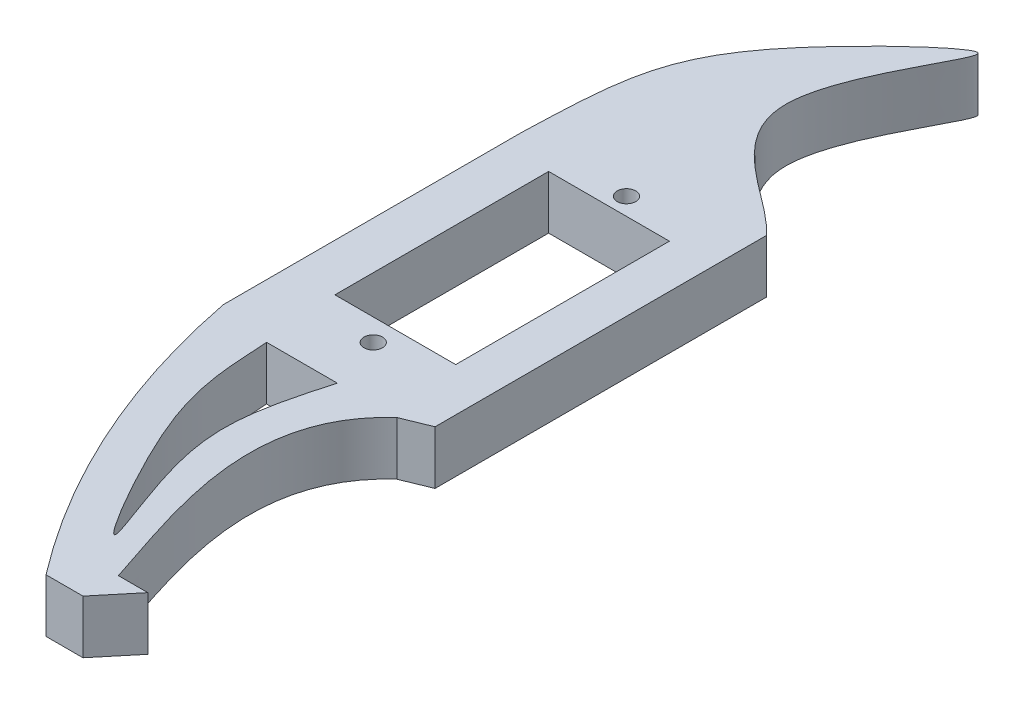
ISO-10303-21;
HEADER;
FILE_DESCRIPTION(('STEP AP214'),'2;1');
FILE_NAME('part.step','',(''),(''),'','','');
FILE_SCHEMA(('AUTOMOTIVE_DESIGN { 1 0 10303 214 1 1 1 1 }'));
ENDSEC;
DATA;
#1=APPLICATION_CONTEXT('core data for automotive mechanical design processes');
#2=APPLICATION_PROTOCOL_DEFINITION('international standard','automotive_design',2000,#1);
#3=PRODUCT_CONTEXT('',#1,'mechanical');
#4=PRODUCT('Part','Part','',(#3));
#5=PRODUCT_RELATED_PRODUCT_CATEGORY('part','',(#4));
#6=PRODUCT_DEFINITION_FORMATION('','',#4);
#7=PRODUCT_DEFINITION_CONTEXT('part definition',#1,'design');
#8=PRODUCT_DEFINITION('design','',#6,#7);
#9=PRODUCT_DEFINITION_SHAPE('','',#8);
#10=(LENGTH_UNIT() NAMED_UNIT(*) SI_UNIT(.MILLI.,.METRE.));
#11=(NAMED_UNIT(*) PLANE_ANGLE_UNIT() SI_UNIT($,.RADIAN.));
#12=(NAMED_UNIT(*) SI_UNIT($,.STERADIAN.) SOLID_ANGLE_UNIT());
#13=UNCERTAINTY_MEASURE_WITH_UNIT(LENGTH_MEASURE(1.E-05),#10,'distance_accuracy_value','');
#14=(GEOMETRIC_REPRESENTATION_CONTEXT(3) GLOBAL_UNCERTAINTY_ASSIGNED_CONTEXT((#13)) GLOBAL_UNIT_ASSIGNED_CONTEXT((#10,
#11,#12)) REPRESENTATION_CONTEXT('',''));
#15=CARTESIAN_POINT('',(0.,0.,0.));
#16=DIRECTION('',(0.,0.,1.));
#17=DIRECTION('',(1.,0.,0.));
#18=AXIS2_PLACEMENT_3D('',#15,#16,#17);
#19=CARTESIAN_POINT('',(19.0483910188657,5.75,-30.8771689485688));
#20=DIRECTION('',(0.,-1.,0.));
#21=DIRECTION('',(0.,0.,-1.));
#22=AXIS2_PLACEMENT_3D('',#19,#20,#21);
#23=PLANE('',#22);
#24=CARTESIAN_POINT('',(15.1920200688134,5.75,-78.3835662755962));
#25=DIRECTION('',(0.,1.,0.));
#26=DIRECTION('',(0.,0.,1.));
#27=AXIS2_PLACEMENT_3D('',#24,#25,#26);
#28=CIRCLE('',#27,1.00000000000001);
#29=CARTESIAN_POINT('',(15.1920200688134,5.75,-77.3835662755962));
#30=VERTEX_POINT('',#29);
#31=EDGE_CURVE('E533',#30,#30,#28,.T.);
#32=ORIENTED_EDGE('',*,*,#31,.F.);
#33=EDGE_LOOP('',(#32));
#34=FACE_BOUND('',#33,.T.);
#35=CARTESIAN_POINT('',(15.1920200688134,5.75,-51.1335662755962));
#36=DIRECTION('',(0.,1.,0.));
#37=DIRECTION('',(0.,0.,1.));
#38=AXIS2_PLACEMENT_3D('',#35,#36,#37);
#39=CIRCLE('',#38,0.999999999999998);
#40=CARTESIAN_POINT('',(15.1920200688134,5.75,-50.1335662755962));
#41=VERTEX_POINT('',#40);
#42=EDGE_CURVE('E168',#41,#41,#39,.T.);
#43=ORIENTED_EDGE('',*,*,#42,.F.);
#44=EDGE_LOOP('',(#43));
#45=FACE_BOUND('',#44,.T.);
#46=DIRECTION('',(0.,0.,1.));
#47=VECTOR('',#46,1.);
#48=CARTESIAN_POINT('',(21.6920200688134,5.75,-76.5085662755962));
#49=LINE('',#48,#47);
#50=CARTESIAN_POINT('',(21.6920200688134,5.75,-76.5085662755962));
#51=VERTEX_POINT('',#50);
#52=CARTESIAN_POINT('',(21.6920200688134,5.75,-53.5085662755962));
#53=VERTEX_POINT('',#52);
#54=EDGE_CURVE('E162',#51,#53,#49,.T.);
#55=ORIENTED_EDGE('',*,*,#54,.T.);
#56=DIRECTION('',(1.,0.,0.));
#57=VECTOR('',#56,1.);
#58=CARTESIAN_POINT('',(20.9420200688134,5.75,-53.5085662755962));
#59=LINE('',#58,#57);
#60=CARTESIAN_POINT('',(8.69202006881276,5.75,-53.5085662755962));
#61=VERTEX_POINT('',#60);
#62=EDGE_CURVE('E153',#61,#53,#59,.T.);
#63=ORIENTED_EDGE('',*,*,#62,.F.);
#64=DIRECTION('',(0.,0.,1.));
#65=VECTOR('',#64,1.);
#66=CARTESIAN_POINT('',(8.69202006881277,5.75,0.));
#67=LINE('',#66,#65);
#68=CARTESIAN_POINT('',(8.69202006881276,5.75,-76.5085662755962));
#69=VERTEX_POINT('',#68);
#70=EDGE_CURVE('E179',#69,#61,#67,.T.);
#71=ORIENTED_EDGE('',*,*,#70,.F.);
#72=DIRECTION('',(-1.,0.,0.));
#73=VECTOR('',#72,1.);
#74=CARTESIAN_POINT('',(9.44202006881276,5.75,-76.5085662755962));
#75=LINE('',#74,#73);
#76=EDGE_CURVE('E187',#51,#69,#75,.T.);
#77=ORIENTED_EDGE('',*,*,#76,.F.);
#78=EDGE_LOOP('',(#55,#63,#71,#77));
#79=FACE_BOUND('',#78,.T.);
#80=CARTESIAN_POINT('',(9.44202006881276,5.75,-45.4087946799536));
#81=CARTESIAN_POINT('',(9.71575170506763,5.75,-40.314684168692));
#82=CARTESIAN_POINT('',(10.0358284543985,5.75,-33.9357504489265));
#83=CARTESIAN_POINT('',(22.1999054978024,5.75,-13.1971961110742));
#84=CARTESIAN_POINT('',(13.7224764971342,5.75,-33.0489839654528));
#85=CARTESIAN_POINT('',(15.2104885690327,5.75,-38.7144059814646));
#86=CARTESIAN_POINT('',(17.0454464333202,5.75,-45.4087946799536));
#87=B_SPLINE_CURVE_WITH_KNOTS('',3,(#80,#81,#82,#83,#84,#85,#86),.UNSPECIFIED.,.F.,.F.,(4,1,1,1,
4),(0.,0.25608681286267,0.513050751056159,0.682655753500473,1.),.UNSPECIFIED.);
#88=CARTESIAN_POINT('',(9.44202006881276,5.75,-45.4087946799536));
#89=VERTEX_POINT('',#88);
#90=CARTESIAN_POINT('',(17.0454464333202,5.75,-45.4087946799536));
#91=VERTEX_POINT('',#90);
#92=EDGE_CURVE('E190',#89,#91,#87,.T.);
#93=ORIENTED_EDGE('',*,*,#92,.F.);
#94=DIRECTION('',(-1.,0.,0.));
#95=VECTOR('',#94,1.);
#96=CARTESIAN_POINT('',(9.44202006881276,5.75,-45.4087946799536));
#97=LINE('',#96,#95);
#98=EDGE_CURVE('E195',#91,#89,#97,.T.);
#99=ORIENTED_EDGE('',*,*,#98,.F.);
#100=EDGE_LOOP('',(#93,#99));
#101=FACE_BOUND('',#100,.T.);
#102=DIRECTION('',(0.92554695620565,0.,-0.378632845720571));
#103=VECTOR('',#102,1.);
#104=CARTESIAN_POINT('',(26.3775586100434,5.75,-46.6019616768082));
#105=LINE('',#104,#103);
#106=CARTESIAN_POINT('',(23.4609281732883,5.75,-45.4087946799536));
#107=VERTEX_POINT('',#106);
#108=CARTESIAN_POINT('',(26.3775586100434,5.75,-46.6019616768082));
#109=VERTEX_POINT('',#108);
#110=EDGE_CURVE('E269',#107,#109,#105,.T.);
#111=ORIENTED_EDGE('',*,*,#110,.T.);
#112=DIRECTION('',(0.,0.,-1.));
#113=VECTOR('',#112,1.);
#114=CARTESIAN_POINT('',(26.3775586100438,5.75,-82.2553721519295));
#115=LINE('',#114,#113);
#116=CARTESIAN_POINT('',(26.3775586100438,5.75,-82.2553721519295));
#117=VERTEX_POINT('',#116);
#118=EDGE_CURVE('E343',#109,#117,#115,.T.);
#119=ORIENTED_EDGE('',*,*,#118,.T.);
#120=CARTESIAN_POINT('',(26.3775586100438,5.75,-82.2553721519295));
#121=CARTESIAN_POINT('',(22.9776874536798,5.75,-86.0646221406842));
#122=CARTESIAN_POINT('',(8.12466218362721,5.75,-91.8440715750146));
#123=CARTESIAN_POINT('',(26.8115043493803,5.75,-117.233625635506));
#124=CARTESIAN_POINT('',(4.16528130687103,5.75,-96.5231996067464));
#125=CARTESIAN_POINT('',(3.97754845297697,5.75,-89.5158525944054));
#126=CARTESIAN_POINT('',(3.60112657571092,5.75,-78.686133294353));
#127=B_SPLINE_CURVE_WITH_KNOTS('',3,(#120,#121,#122,#123,#124,#125,#126),.UNSPECIFIED.,.F.,.F.,
(4,1,1,1,4),(0.,0.243535756029824,0.469285780942286,0.650563803677233,1.),.UNSPECIFIED.);
#128=CARTESIAN_POINT('',(3.60112657571092,5.75,-78.686133294353));
#129=VERTEX_POINT('',#128);
#130=EDGE_CURVE('E299',#117,#129,#127,.T.);
#131=ORIENTED_EDGE('',*,*,#130,.T.);
#132=DIRECTION('',(0.,0.,1.));
#133=VECTOR('',#132,1.);
#134=CARTESIAN_POINT('',(3.60112657571092,5.75,-78.686133294353));
#135=LINE('',#134,#133);
#136=CARTESIAN_POINT('',(3.60112657571092,5.75,-46.6019616768082));
#137=VERTEX_POINT('',#136);
#138=EDGE_CURVE('E318',#129,#137,#135,.T.);
#139=ORIENTED_EDGE('',*,*,#138,.T.);
#140=CARTESIAN_POINT('',(3.60112657571093,5.75,-46.6019616768082));
#141=CARTESIAN_POINT('',(7.36774822974956,5.75,-27.41314657739));
#142=CARTESIAN_POINT('',(19.2342963689623,5.75,-11.8782004684211));
#143=B_SPLINE_CURVE_WITH_KNOTS('',2,(#140,#141,#142),.UNSPECIFIED.,.F.,.F.,(3,3),(0.,1.),.UNSPECIFIED.);
#144=CARTESIAN_POINT('',(19.2342963689623,5.75,-11.8782004684211));
#145=VERTEX_POINT('',#144);
#146=EDGE_CURVE('E314',#137,#145,#143,.T.);
#147=ORIENTED_EDGE('',*,*,#146,.T.);
#148=DIRECTION('',(1.,0.,0.));
#149=VECTOR('',#148,1.);
#150=CARTESIAN_POINT('',(19.2342963689623,5.75,-11.8782004684211));
#151=LINE('',#150,#149);
#152=CARTESIAN_POINT('',(23.2120175490561,5.75,-11.8782004684211));
#153=VERTEX_POINT('',#152);
#154=EDGE_CURVE('E317',#145,#153,#151,.T.);
#155=ORIENTED_EDGE('',*,*,#154,.T.);
#156=CARTESIAN_POINT('',(23.2120175490561,5.75,-11.8782004684211));
#157=CARTESIAN_POINT('',(26.3775586100434,5.75,-15.6885340158092));
#158=B_SPLINE_CURVE_WITH_KNOTS('',1,(#156,#157),.UNSPECIFIED.,.F.,.F.,(2,2),(0.,1.),.UNSPECIFIED.);
#159=CARTESIAN_POINT('',(26.3775586100434,5.75,-15.6885340158092));
#160=VERTEX_POINT('',#159);
#161=EDGE_CURVE('E320',#153,#160,#158,.T.);
#162=ORIENTED_EDGE('',*,*,#161,.T.);
#163=DIRECTION('',(-1.,0.,0.));
#164=VECTOR('',#163,1.);
#165=CARTESIAN_POINT('',(23.2120175490561,5.75,-15.6885340158092));
#166=LINE('',#165,#164);
#167=CARTESIAN_POINT('',(23.2120175490561,5.75,-15.6885340158092));
#168=VERTEX_POINT('',#167);
#169=EDGE_CURVE('E228',#160,#168,#166,.T.);
#170=ORIENTED_EDGE('',*,*,#169,.T.);
#171=CARTESIAN_POINT('',(23.2120175490561,5.75,-15.6885340158092));
#172=CARTESIAN_POINT('',(20.4347451452465,5.75,-24.3444521861075));
#173=CARTESIAN_POINT('',(14.8033156642805,5.75,-37.628888778155));
#174=CARTESIAN_POINT('',(23.4609281732883,5.75,-45.4087946799536));
#175=B_SPLINE_CURVE_WITH_KNOTS('',3,(#171,#172,#173,#174),.UNSPECIFIED.,.F.,.F.,(4,4),(0.,1.),.UNSPECIFIED.);
#176=EDGE_CURVE('E221',#168,#107,#175,.T.);
#177=ORIENTED_EDGE('',*,*,#176,.T.);
#178=EDGE_LOOP('',(#111,#119,#131,#139,#147,#155,#162,#170,#177));
#179=FACE_BOUND('',#178,.T.);
#180=ADVANCED_FACE('F34',(#34,#45,#79,#101,#179),#23,.F.);
#181=CARTESIAN_POINT('',(19.0483910188657,0.,-30.8771689485688));
#182=DIRECTION('',(0.,-1.,0.));
#183=DIRECTION('',(0.,0.,-1.));
#184=AXIS2_PLACEMENT_3D('',#181,#182,#183);
#185=PLANE('',#184);
#186=CARTESIAN_POINT('',(15.1920200688134,0.,-78.3835662755962));
#187=DIRECTION('',(0.,-1.,0.));
#188=DIRECTION('',(0.,0.,-1.));
#189=AXIS2_PLACEMENT_3D('',#186,#187,#188);
#190=CIRCLE('',#189,1.00000000000001);
#191=CARTESIAN_POINT('',(15.1920200688134,0.,-77.3835662755962));
#192=VERTEX_POINT('',#191);
#193=EDGE_CURVE('E530',#192,#192,#190,.F.);
#194=ORIENTED_EDGE('',*,*,#193,.T.);
#195=EDGE_LOOP('',(#194));
#196=FACE_BOUND('',#195,.T.);
#197=CARTESIAN_POINT('',(15.1920200688134,0.,-51.1335662755962));
#198=DIRECTION('',(0.,-1.,0.));
#199=DIRECTION('',(0.,0.,-1.));
#200=AXIS2_PLACEMENT_3D('',#197,#198,#199);
#201=CIRCLE('',#200,0.999999999999998);
#202=CARTESIAN_POINT('',(15.1920200688134,0.,-50.1335662755962));
#203=VERTEX_POINT('',#202);
#204=EDGE_CURVE('E171',#203,#203,#201,.F.);
#205=ORIENTED_EDGE('',*,*,#204,.T.);
#206=EDGE_LOOP('',(#205));
#207=FACE_BOUND('',#206,.T.);
#208=DIRECTION('',(1.,0.,0.));
#209=VECTOR('',#208,1.);
#210=CARTESIAN_POINT('',(20.9420200688134,0.,-53.5085662755962));
#211=LINE('',#210,#209);
#212=CARTESIAN_POINT('',(8.69202006881276,0.,-53.5085662755962));
#213=VERTEX_POINT('',#212);
#214=CARTESIAN_POINT('',(21.6920200688134,0.,-53.5085662755962));
#215=VERTEX_POINT('',#214);
#216=EDGE_CURVE('E154',#213,#215,#211,.T.);
#217=ORIENTED_EDGE('',*,*,#216,.T.);
#218=DIRECTION('',(0.,0.,1.));
#219=VECTOR('',#218,1.);
#220=CARTESIAN_POINT('',(21.6920200688134,0.,-76.5085662755962));
#221=LINE('',#220,#219);
#222=CARTESIAN_POINT('',(21.6920200688134,0.,-76.5085662755962));
#223=VERTEX_POINT('',#222);
#224=EDGE_CURVE('E160',#223,#215,#221,.T.);
#225=ORIENTED_EDGE('',*,*,#224,.F.);
#226=DIRECTION('',(-1.,0.,0.));
#227=VECTOR('',#226,1.);
#228=CARTESIAN_POINT('',(9.44202006881276,0.,-76.5085662755962));
#229=LINE('',#228,#227);
#230=CARTESIAN_POINT('',(8.69202006881276,0.,-76.5085662755962));
#231=VERTEX_POINT('',#230);
#232=EDGE_CURVE('E142',#223,#231,#229,.T.);
#233=ORIENTED_EDGE('',*,*,#232,.T.);
#234=DIRECTION('',(0.,0.,1.));
#235=VECTOR('',#234,1.);
#236=CARTESIAN_POINT('',(8.69202006881277,0.,0.));
#237=LINE('',#236,#235);
#238=EDGE_CURVE('E177',#231,#213,#237,.T.);
#239=ORIENTED_EDGE('',*,*,#238,.T.);
#240=EDGE_LOOP('',(#217,#225,#233,#239));
#241=FACE_BOUND('',#240,.T.);
#242=DIRECTION('',(-1.,0.,0.));
#243=VECTOR('',#242,1.);
#244=CARTESIAN_POINT('',(9.44202006881276,0.,-45.4087946799536));
#245=LINE('',#244,#243);
#246=CARTESIAN_POINT('',(17.0454464333202,0.,-45.4087946799536));
#247=VERTEX_POINT('',#246);
#248=CARTESIAN_POINT('',(9.44202006881276,0.,-45.4087946799536));
#249=VERTEX_POINT('',#248);
#250=EDGE_CURVE('E196',#247,#249,#245,.T.);
#251=ORIENTED_EDGE('',*,*,#250,.T.);
#252=CARTESIAN_POINT('',(9.44202006881276,0.,-45.4087946799536));
#253=CARTESIAN_POINT('',(9.71575170506763,0.,-40.314684168692));
#254=CARTESIAN_POINT('',(10.0358284543985,0.,-33.9357504489265));
#255=CARTESIAN_POINT('',(22.1999054978024,0.,-13.1971961110742));
#256=CARTESIAN_POINT('',(13.7224764971342,0.,-33.0489839654528));
#257=CARTESIAN_POINT('',(15.2104885690327,0.,-38.7144059814646));
#258=CARTESIAN_POINT('',(17.0454464333202,0.,-45.4087946799536));
#259=B_SPLINE_CURVE_WITH_KNOTS('',3,(#252,#253,#254,#255,#256,#257,#258),.UNSPECIFIED.,.F.,.F.,
(4,1,1,1,4),(0.,0.25608681286267,0.513050751056159,0.682655753500473,1.),.UNSPECIFIED.);
#260=EDGE_CURVE('E56',#249,#247,#259,.T.);
#261=ORIENTED_EDGE('',*,*,#260,.T.);
#262=EDGE_LOOP('',(#251,#261));
#263=FACE_BOUND('',#262,.T.);
#264=DIRECTION('',(0.92554695620565,0.,-0.378632845720571));
#265=VECTOR('',#264,1.);
#266=CARTESIAN_POINT('',(26.3775586100434,0.,-46.6019616768082));
#267=LINE('',#266,#265);
#268=CARTESIAN_POINT('',(23.4609281732883,0.,-45.4087946799536));
#269=VERTEX_POINT('',#268);
#270=CARTESIAN_POINT('',(26.3775586100434,0.,-46.6019616768082));
#271=VERTEX_POINT('',#270);
#272=EDGE_CURVE('E230',#269,#271,#267,.T.);
#273=ORIENTED_EDGE('',*,*,#272,.F.);
#274=CARTESIAN_POINT('',(23.2120175490561,0.,-15.6885340158092));
#275=CARTESIAN_POINT('',(20.4347451452465,0.,-24.3444521861075));
#276=CARTESIAN_POINT('',(14.8033156642805,0.,-37.628888778155));
#277=CARTESIAN_POINT('',(23.4609281732883,0.,-45.4087946799536));
#278=B_SPLINE_CURVE_WITH_KNOTS('',3,(#274,#275,#276,#277),.UNSPECIFIED.,.F.,.F.,(4,4),(0.,1.),.UNSPECIFIED.);
#279=CARTESIAN_POINT('',(23.2120175490561,0.,-15.6885340158092));
#280=VERTEX_POINT('',#279);
#281=EDGE_CURVE('E265',#280,#269,#278,.T.);
#282=ORIENTED_EDGE('',*,*,#281,.F.);
#283=DIRECTION('',(-1.,0.,0.));
#284=VECTOR('',#283,1.);
#285=CARTESIAN_POINT('',(23.2120175490561,0.,-15.6885340158092));
#286=LINE('',#285,#284);
#287=CARTESIAN_POINT('',(26.3775586100434,0.,-15.6885340158092));
#288=VERTEX_POINT('',#287);
#289=EDGE_CURVE('E260',#288,#280,#286,.T.);
#290=ORIENTED_EDGE('',*,*,#289,.F.);
#291=CARTESIAN_POINT('',(23.2120175490561,0.,-11.8782004684211));
#292=CARTESIAN_POINT('',(26.3775586100434,0.,-15.6885340158092));
#293=B_SPLINE_CURVE_WITH_KNOTS('',1,(#291,#292),.UNSPECIFIED.,.F.,.F.,(2,2),(0.,1.),.UNSPECIFIED.);
#294=CARTESIAN_POINT('',(23.2120175490561,0.,-11.8782004684211));
#295=VERTEX_POINT('',#294);
#296=EDGE_CURVE('E256',#295,#288,#293,.T.);
#297=ORIENTED_EDGE('',*,*,#296,.F.);
#298=DIRECTION('',(1.,0.,0.));
#299=VECTOR('',#298,1.);
#300=CARTESIAN_POINT('',(19.2342963689623,0.,-11.8782004684211));
#301=LINE('',#300,#299);
#302=CARTESIAN_POINT('',(19.2342963689623,0.,-11.8782004684211));
#303=VERTEX_POINT('',#302);
#304=EDGE_CURVE('E251',#303,#295,#301,.T.);
#305=ORIENTED_EDGE('',*,*,#304,.F.);
#306=CARTESIAN_POINT('',(3.60112657571093,0.,-46.6019616768082));
#307=CARTESIAN_POINT('',(7.36774822974956,0.,-27.41314657739));
#308=CARTESIAN_POINT('',(19.2342963689623,0.,-11.8782004684211));
#309=B_SPLINE_CURVE_WITH_KNOTS('',2,(#306,#307,#308),.UNSPECIFIED.,.F.,.F.,(3,3),(0.,1.),.UNSPECIFIED.);
#310=CARTESIAN_POINT('',(3.60112657571092,0.,-46.6019616768082));
#311=VERTEX_POINT('',#310);
#312=EDGE_CURVE('E247',#311,#303,#309,.T.);
#313=ORIENTED_EDGE('',*,*,#312,.F.);
#314=DIRECTION('',(0.,0.,1.));
#315=VECTOR('',#314,1.);
#316=CARTESIAN_POINT('',(3.60112657571092,0.,-78.686133294353));
#317=LINE('',#316,#315);
#318=CARTESIAN_POINT('',(3.60112657571092,0.,-78.686133294353));
#319=VERTEX_POINT('',#318);
#320=EDGE_CURVE('E242',#319,#311,#317,.T.);
#321=ORIENTED_EDGE('',*,*,#320,.F.);
#322=CARTESIAN_POINT('',(26.3775586100438,0.,-82.2553721519295));
#323=CARTESIAN_POINT('',(22.9776874536798,0.,-86.0646221406842));
#324=CARTESIAN_POINT('',(8.12466218362721,0.,-91.8440715750146));
#325=CARTESIAN_POINT('',(26.8115043493803,0.,-117.233625635506));
#326=CARTESIAN_POINT('',(4.16528130687103,0.,-96.5231996067464));
#327=CARTESIAN_POINT('',(3.97754845297697,0.,-89.5158525944054));
#328=CARTESIAN_POINT('',(3.60112657571092,0.,-78.686133294353));
#329=B_SPLINE_CURVE_WITH_KNOTS('',3,(#322,#323,#324,#325,#326,#327,#328),.UNSPECIFIED.,.F.,.F.,
(4,1,1,1,4),(0.,0.243535756029824,0.469285780942286,0.650563803677233,1.),.UNSPECIFIED.);
#330=CARTESIAN_POINT('',(26.3775586100438,0.,-82.2553721519295));
#331=VERTEX_POINT('',#330);
#332=EDGE_CURVE('E238',#331,#319,#329,.T.);
#333=ORIENTED_EDGE('',*,*,#332,.F.);
#334=DIRECTION('',(0.,0.,-1.));
#335=VECTOR('',#334,1.);
#336=CARTESIAN_POINT('',(26.3775586100438,0.,-82.2553721519295));
#337=LINE('',#336,#335);
#338=EDGE_CURVE('E236',#271,#331,#337,.T.);
#339=ORIENTED_EDGE('',*,*,#338,.F.);
#340=EDGE_LOOP('',(#273,#282,#290,#297,#305,#313,#321,#333,#339));
#341=FACE_BOUND('',#340,.T.);
#342=ADVANCED_FACE('F165',(#196,#207,#241,#263,#341),#185,.T.);
#343=CARTESIAN_POINT('',(26.3775586100434,5.75,-46.6019616768082));
#344=DIRECTION('',(-0.378632845720571,0.,-0.92554695620565));
#345=DIRECTION('',(-0.92554695620565,0.,0.378632845720571));
#346=AXIS2_PLACEMENT_3D('',#343,#344,#345);
#347=PLANE('',#346);
#348=ORIENTED_EDGE('',*,*,#272,.T.);
#349=DIRECTION('',(0.,-1.,0.));
#350=VECTOR('',#349,1.);
#351=CARTESIAN_POINT('',(26.3775586100434,5.75,-46.6019616768082));
#352=LINE('',#351,#350);
#353=EDGE_CURVE('E11',#109,#271,#352,.T.);
#354=ORIENTED_EDGE('',*,*,#353,.F.);
#355=ORIENTED_EDGE('',*,*,#110,.F.);
#356=DIRECTION('',(0.,-1.,0.));
#357=VECTOR('',#356,1.);
#358=CARTESIAN_POINT('',(23.4609281732883,5.75,-45.4087946799536));
#359=LINE('',#358,#357);
#360=EDGE_CURVE('E227',#107,#269,#359,.T.);
#361=ORIENTED_EDGE('',*,*,#360,.T.);
#362=EDGE_LOOP('',(#348,#354,#355,#361));
#363=FACE_BOUND('',#362,.T.);
#364=ADVANCED_FACE('F36',(#363),#347,.F.);
#365=CARTESIAN_POINT('',(26.3775586100438,5.75,-82.2553721519295));
#366=DIRECTION('',(-1.,0.,0.));
#367=DIRECTION('',(0.,0.,1.));
#368=AXIS2_PLACEMENT_3D('',#365,#366,#367);
#369=PLANE('',#368);
#370=ORIENTED_EDGE('',*,*,#338,.T.);
#371=DIRECTION('',(0.,-1.,0.));
#372=VECTOR('',#371,1.);
#373=CARTESIAN_POINT('',(26.3775586100438,5.75,-82.2553721519295));
#374=LINE('',#373,#372);
#375=EDGE_CURVE('E42',#117,#331,#374,.T.);
#376=ORIENTED_EDGE('',*,*,#375,.F.);
#377=ORIENTED_EDGE('',*,*,#118,.F.);
#378=ORIENTED_EDGE('',*,*,#353,.T.);
#379=EDGE_LOOP('',(#370,#376,#377,#378));
#380=FACE_BOUND('',#379,.T.);
#381=ADVANCED_FACE('F338',(#380),#369,.F.);
#382=DIRECTION('',(0.,-1.,0.));
#383=VECTOR('',#382,1.);
#384=SURFACE_OF_LINEAR_EXTRUSION('',#127,#383);
#385=ORIENTED_EDGE('',*,*,#332,.T.);
#386=DIRECTION('',(0.,-1.,0.));
#387=VECTOR('',#386,1.);
#388=CARTESIAN_POINT('',(3.60112657571092,5.75,-78.686133294353));
#389=LINE('',#388,#387);
#390=EDGE_CURVE('E290',#129,#319,#389,.T.);
#391=ORIENTED_EDGE('',*,*,#390,.F.);
#392=ORIENTED_EDGE('',*,*,#130,.F.);
#393=ORIENTED_EDGE('',*,*,#375,.T.);
#394=EDGE_LOOP('',(#385,#391,#392,#393));
#395=FACE_BOUND('',#394,.T.);
#396=ADVANCED_FACE('F297',(#395),#384,.F.);
#397=CARTESIAN_POINT('',(3.60112657571092,5.75,-78.686133294353));
#398=DIRECTION('',(1.,0.,0.));
#399=DIRECTION('',(0.,0.,-1.));
#400=AXIS2_PLACEMENT_3D('',#397,#398,#399);
#401=PLANE('',#400);
#402=ORIENTED_EDGE('',*,*,#320,.T.);
#403=DIRECTION('',(0.,-1.,0.));
#404=VECTOR('',#403,1.);
#405=CARTESIAN_POINT('',(3.60112657571092,5.75,-46.6019616768082));
#406=LINE('',#405,#404);
#407=EDGE_CURVE('E287',#137,#311,#406,.T.);
#408=ORIENTED_EDGE('',*,*,#407,.F.);
#409=ORIENTED_EDGE('',*,*,#138,.F.);
#410=ORIENTED_EDGE('',*,*,#390,.T.);
#411=EDGE_LOOP('',(#402,#408,#409,#410));
#412=FACE_BOUND('',#411,.T.);
#413=ADVANCED_FACE('F308',(#412),#401,.F.);
#414=DIRECTION('',(0.,-1.,0.));
#415=VECTOR('',#414,1.);
#416=SURFACE_OF_LINEAR_EXTRUSION('',#143,#415);
#417=ORIENTED_EDGE('',*,*,#312,.T.);
#418=DIRECTION('',(0.,-1.,0.));
#419=VECTOR('',#418,1.);
#420=CARTESIAN_POINT('',(19.2342963689623,5.75,-11.8782004684211));
#421=LINE('',#420,#419);
#422=EDGE_CURVE('E284',#145,#303,#421,.T.);
#423=ORIENTED_EDGE('',*,*,#422,.F.);
#424=ORIENTED_EDGE('',*,*,#146,.F.);
#425=ORIENTED_EDGE('',*,*,#407,.T.);
#426=EDGE_LOOP('',(#417,#423,#424,#425));
#427=FACE_BOUND('',#426,.T.);
#428=ADVANCED_FACE('F312',(#427),#416,.F.);
#429=CARTESIAN_POINT('',(19.2342963689623,5.75,-11.8782004684211));
#430=DIRECTION('',(0.,0.,-1.));
#431=DIRECTION('',(-1.,0.,0.));
#432=AXIS2_PLACEMENT_3D('',#429,#430,#431);
#433=PLANE('',#432);
#434=ORIENTED_EDGE('',*,*,#304,.T.);
#435=DIRECTION('',(0.,-1.,0.));
#436=VECTOR('',#435,1.);
#437=CARTESIAN_POINT('',(23.2120175490561,5.75,-11.8782004684211));
#438=LINE('',#437,#436);
#439=EDGE_CURVE('E281',#153,#295,#438,.T.);
#440=ORIENTED_EDGE('',*,*,#439,.F.);
#441=ORIENTED_EDGE('',*,*,#154,.F.);
#442=ORIENTED_EDGE('',*,*,#422,.T.);
#443=EDGE_LOOP('',(#434,#440,#441,#442));
#444=FACE_BOUND('',#443,.T.);
#445=ADVANCED_FACE('F334',(#444),#433,.F.);
#446=CARTESIAN_POINT('',(23.2120175490561,5.75,-11.8782004684211));
#447=DIRECTION('',(-0.769187079710325,0.,-0.639023658722197));
#448=DIRECTION('',(-0.639023658722197,0.,0.769187079710325));
#449=AXIS2_PLACEMENT_3D('',#446,#447,#448);
#450=PLANE('',#449);
#451=ORIENTED_EDGE('',*,*,#296,.T.);
#452=DIRECTION('',(0.,-1.,0.));
#453=VECTOR('',#452,1.);
#454=CARTESIAN_POINT('',(26.3775586100434,5.75,-15.6885340158092));
#455=LINE('',#454,#453);
#456=EDGE_CURVE('E278',#160,#288,#455,.T.);
#457=ORIENTED_EDGE('',*,*,#456,.F.);
#458=ORIENTED_EDGE('',*,*,#161,.F.);
#459=ORIENTED_EDGE('',*,*,#439,.T.);
#460=EDGE_LOOP('',(#451,#457,#458,#459));
#461=FACE_BOUND('',#460,.T.);
#462=ADVANCED_FACE('F452',(#461),#450,.F.);
#463=CARTESIAN_POINT('',(23.2120175490561,5.75,-15.6885340158092));
#464=DIRECTION('',(0.,0.,1.));
#465=DIRECTION('',(1.,0.,0.));
#466=AXIS2_PLACEMENT_3D('',#463,#464,#465);
#467=PLANE('',#466);
#468=ORIENTED_EDGE('',*,*,#289,.T.);
#469=DIRECTION('',(0.,-1.,0.));
#470=VECTOR('',#469,1.);
#471=CARTESIAN_POINT('',(23.2120175490561,5.75,-15.6885340158092));
#472=LINE('',#471,#470);
#473=EDGE_CURVE('E275',#168,#280,#472,.T.);
#474=ORIENTED_EDGE('',*,*,#473,.F.);
#475=ORIENTED_EDGE('',*,*,#169,.F.);
#476=ORIENTED_EDGE('',*,*,#456,.T.);
#477=EDGE_LOOP('',(#468,#474,#475,#476));
#478=FACE_BOUND('',#477,.T.);
#479=ADVANCED_FACE('F218',(#478),#467,.F.);
#480=DIRECTION('',(0.,-1.,0.));
#481=VECTOR('',#480,1.);
#482=SURFACE_OF_LINEAR_EXTRUSION('',#175,#481);
#483=ORIENTED_EDGE('',*,*,#281,.T.);
#484=ORIENTED_EDGE('',*,*,#360,.F.);
#485=ORIENTED_EDGE('',*,*,#176,.F.);
#486=ORIENTED_EDGE('',*,*,#473,.T.);
#487=EDGE_LOOP('',(#483,#484,#485,#486));
#488=FACE_BOUND('',#487,.T.);
#489=ADVANCED_FACE('F207',(#488),#482,.F.);
#490=DIRECTION('',(0.,-1.,0.));
#491=VECTOR('',#490,1.);
#492=SURFACE_OF_LINEAR_EXTRUSION('',#87,#491);
#493=ORIENTED_EDGE('',*,*,#260,.F.);
#494=DIRECTION('',(0.,-1.,0.));
#495=VECTOR('',#494,1.);
#496=CARTESIAN_POINT('',(9.44202006881276,5.75,-45.4087946799536));
#497=LINE('',#496,#495);
#498=EDGE_CURVE('E351',#89,#249,#497,.T.);
#499=ORIENTED_EDGE('',*,*,#498,.F.);
#500=ORIENTED_EDGE('',*,*,#92,.T.);
#501=DIRECTION('',(0.,-1.,0.));
#502=VECTOR('',#501,1.);
#503=CARTESIAN_POINT('',(17.0454464333202,5.75,-45.4087946799536));
#504=LINE('',#503,#502);
#505=EDGE_CURVE('E49',#91,#247,#504,.T.);
#506=ORIENTED_EDGE('',*,*,#505,.T.);
#507=EDGE_LOOP('',(#493,#499,#500,#506));
#508=FACE_BOUND('',#507,.T.);
#509=ADVANCED_FACE('F202',(#508),#492,.T.);
#510=CARTESIAN_POINT('',(9.44202006881276,5.75,-45.4087946799536));
#511=DIRECTION('',(0.,0.,1.));
#512=DIRECTION('',(1.,0.,0.));
#513=AXIS2_PLACEMENT_3D('',#510,#511,#512);
#514=PLANE('',#513);
#515=ORIENTED_EDGE('',*,*,#250,.F.);
#516=ORIENTED_EDGE('',*,*,#505,.F.);
#517=ORIENTED_EDGE('',*,*,#98,.T.);
#518=ORIENTED_EDGE('',*,*,#498,.T.);
#519=EDGE_LOOP('',(#515,#516,#517,#518));
#520=FACE_BOUND('',#519,.T.);
#521=ADVANCED_FACE('F206',(#520),#514,.T.);
#522=CARTESIAN_POINT('',(20.9420200688134,5.75,-53.5085662755962));
#523=DIRECTION('',(0.,0.,-1.));
#524=DIRECTION('',(-1.,0.,0.));
#525=AXIS2_PLACEMENT_3D('',#522,#523,#524);
#526=PLANE('',#525);
#527=ORIENTED_EDGE('',*,*,#216,.F.);
#528=DIRECTION('',(0.,1.,0.));
#529=VECTOR('',#528,1.);
#530=CARTESIAN_POINT('',(8.69202006881276,-0.00100000000000013,-53.5085662755962));
#531=LINE('',#530,#529);
#532=EDGE_CURVE('E182',#213,#61,#531,.T.);
#533=ORIENTED_EDGE('',*,*,#532,.T.);
#534=ORIENTED_EDGE('',*,*,#62,.T.);
#535=DIRECTION('',(0.,1.,0.));
#536=VECTOR('',#535,1.);
#537=CARTESIAN_POINT('',(21.6920200688134,-0.00100000000000013,-53.5085662755962));
#538=LINE('',#537,#536);
#539=EDGE_CURVE('E163',#215,#53,#538,.T.);
#540=ORIENTED_EDGE('',*,*,#539,.F.);
#541=EDGE_LOOP('',(#527,#533,#534,#540));
#542=FACE_BOUND('',#541,.T.);
#543=ADVANCED_FACE('F413',(#542),#526,.T.);
#544=CARTESIAN_POINT('',(9.44202006881276,5.75,-76.5085662755962));
#545=DIRECTION('',(0.,0.,1.));
#546=DIRECTION('',(1.,0.,0.));
#547=AXIS2_PLACEMENT_3D('',#544,#545,#546);
#548=PLANE('',#547);
#549=ORIENTED_EDGE('',*,*,#232,.F.);
#550=DIRECTION('',(0.,1.,0.));
#551=VECTOR('',#550,1.);
#552=CARTESIAN_POINT('',(21.6920200688134,-0.00100000000000013,-76.5085662755962));
#553=LINE('',#552,#551);
#554=EDGE_CURVE('E145',#223,#51,#553,.T.);
#555=ORIENTED_EDGE('',*,*,#554,.T.);
#556=ORIENTED_EDGE('',*,*,#76,.T.);
#557=DIRECTION('',(0.,1.,0.));
#558=VECTOR('',#557,1.);
#559=CARTESIAN_POINT('',(8.69202006881276,-0.00100000000000013,-76.5085662755962));
#560=LINE('',#559,#558);
#561=EDGE_CURVE('E148',#231,#69,#560,.T.);
#562=ORIENTED_EDGE('',*,*,#561,.F.);
#563=EDGE_LOOP('',(#549,#555,#556,#562));
#564=FACE_BOUND('',#563,.T.);
#565=ADVANCED_FACE('F144',(#564),#548,.T.);
#566=CARTESIAN_POINT('',(8.69202006881277,-0.00100000000000013,0.));
#567=DIRECTION('',(-1.,0.,0.));
#568=DIRECTION('',(0.,0.,1.));
#569=AXIS2_PLACEMENT_3D('',#566,#567,#568);
#570=PLANE('',#569);
#571=ORIENTED_EDGE('',*,*,#561,.T.);
#572=ORIENTED_EDGE('',*,*,#70,.T.);
#573=ORIENTED_EDGE('',*,*,#532,.F.);
#574=ORIENTED_EDGE('',*,*,#238,.F.);
#575=EDGE_LOOP('',(#571,#572,#573,#574));
#576=FACE_BOUND('',#575,.T.);
#577=ADVANCED_FACE('F393',(#576),#570,.F.);
#578=CARTESIAN_POINT('',(21.6920200688134,-0.00100000000000013,-76.5085662755962));
#579=DIRECTION('',(-1.,0.,0.));
#580=DIRECTION('',(0.,0.,1.));
#581=AXIS2_PLACEMENT_3D('',#578,#579,#580);
#582=PLANE('',#581);
#583=ORIENTED_EDGE('',*,*,#224,.T.);
#584=ORIENTED_EDGE('',*,*,#539,.T.);
#585=ORIENTED_EDGE('',*,*,#54,.F.);
#586=ORIENTED_EDGE('',*,*,#554,.F.);
#587=EDGE_LOOP('',(#583,#584,#585,#586));
#588=FACE_BOUND('',#587,.T.);
#589=ADVANCED_FACE('F158',(#588),#582,.T.);
#590=CARTESIAN_POINT('',(15.1920200688134,-0.00100000000000013,-51.1335662755962));
#591=DIRECTION('',(0.,1.,0.));
#592=DIRECTION('',(0.,0.,1.));
#593=AXIS2_PLACEMENT_3D('',#590,#591,#592);
#594=CYLINDRICAL_SURFACE('',#593,0.999999999999998);
#595=CARTESIAN_POINT('',(15.1920200688134,0.,-50.1335662755962));
#596=CARTESIAN_POINT('',(15.1920200688134,0.0598958333333332,-50.1335662755962));
#597=CARTESIAN_POINT('',(15.1920200688134,0.119791666666667,-50.1335662755962));
#598=CARTESIAN_POINT('',(15.1920200688134,0.239583333333333,-50.1335662755962));
#599=CARTESIAN_POINT('',(15.1920200688134,0.299479166666667,-50.1335662755962));
#600=CARTESIAN_POINT('',(15.1920200688134,0.419270833333333,-50.1335662755962));
#601=CARTESIAN_POINT('',(15.1920200688134,0.479166666666667,-50.1335662755962));
#602=CARTESIAN_POINT('',(15.1920200688134,0.598958333333333,-50.1335662755962));
#603=CARTESIAN_POINT('',(15.1920200688134,0.658854166666667,-50.1335662755962));
#604=CARTESIAN_POINT('',(15.1920200688134,0.778645833333333,-50.1335662755962));
#605=CARTESIAN_POINT('',(15.1920200688134,0.838541666666667,-50.1335662755962));
#606=CARTESIAN_POINT('',(15.1920200688134,0.958333333333333,-50.1335662755962));
#607=CARTESIAN_POINT('',(15.1920200688134,1.01822916666667,-50.1335662755962));
#608=CARTESIAN_POINT('',(15.1920200688134,1.13802083333333,-50.1335662755962));
#609=CARTESIAN_POINT('',(15.1920200688134,1.19791666666667,-50.1335662755962));
#610=CARTESIAN_POINT('',(15.1920200688134,1.31770833333333,-50.1335662755962));
#611=CARTESIAN_POINT('',(15.1920200688134,1.37760416666667,-50.1335662755962));
#612=CARTESIAN_POINT('',(15.1920200688134,1.49739583333333,-50.1335662755962));
#613=CARTESIAN_POINT('',(15.1920200688134,1.55729166666667,-50.1335662755962));
#614=CARTESIAN_POINT('',(15.1920200688134,1.67708333333333,-50.1335662755962));
#615=CARTESIAN_POINT('',(15.1920200688134,1.73697916666667,-50.1335662755962));
#616=CARTESIAN_POINT('',(15.1920200688134,1.85677083333333,-50.1335662755962));
#617=CARTESIAN_POINT('',(15.1920200688134,1.91666666666667,-50.1335662755962));
#618=CARTESIAN_POINT('',(15.1920200688134,2.03645833333333,-50.1335662755962));
#619=CARTESIAN_POINT('',(15.1920200688134,2.09635416666667,-50.1335662755962));
#620=CARTESIAN_POINT('',(15.1920200688134,2.21614583333333,-50.1335662755962));
#621=CARTESIAN_POINT('',(15.1920200688134,2.27604166666667,-50.1335662755962));
#622=CARTESIAN_POINT('',(15.1920200688134,2.39583333333333,-50.1335662755962));
#623=CARTESIAN_POINT('',(15.1920200688134,2.45572916666667,-50.1335662755962));
#624=CARTESIAN_POINT('',(15.1920200688134,2.57552083333333,-50.1335662755962));
#625=CARTESIAN_POINT('',(15.1920200688134,2.63541666666667,-50.1335662755962));
#626=CARTESIAN_POINT('',(15.1920200688134,2.75520833333333,-50.1335662755962));
#627=CARTESIAN_POINT('',(15.1920200688134,2.81510416666667,-50.1335662755962));
#628=CARTESIAN_POINT('',(15.1920200688134,2.93489583333333,-50.1335662755962));
#629=CARTESIAN_POINT('',(15.1920200688134,2.99479166666667,-50.1335662755962));
#630=CARTESIAN_POINT('',(15.1920200688134,3.11458333333333,-50.1335662755962));
#631=CARTESIAN_POINT('',(15.1920200688134,3.17447916666667,-50.1335662755962));
#632=CARTESIAN_POINT('',(15.1920200688134,3.29427083333333,-50.1335662755962));
#633=CARTESIAN_POINT('',(15.1920200688134,3.35416666666667,-50.1335662755962));
#634=CARTESIAN_POINT('',(15.1920200688134,3.47395833333333,-50.1335662755962));
#635=CARTESIAN_POINT('',(15.1920200688134,3.53385416666667,-50.1335662755962));
#636=CARTESIAN_POINT('',(15.1920200688134,3.65364583333333,-50.1335662755962));
#637=CARTESIAN_POINT('',(15.1920200688134,3.71354166666667,-50.1335662755962));
#638=CARTESIAN_POINT('',(15.1920200688134,3.83333333333333,-50.1335662755962));
#639=CARTESIAN_POINT('',(15.1920200688134,3.89322916666667,-50.1335662755962));
#640=CARTESIAN_POINT('',(15.1920200688134,4.01302083333333,-50.1335662755962));
#641=CARTESIAN_POINT('',(15.1920200688134,4.07291666666667,-50.1335662755962));
#642=CARTESIAN_POINT('',(15.1920200688134,4.19270833333333,-50.1335662755962));
#643=CARTESIAN_POINT('',(15.1920200688134,4.25260416666667,-50.1335662755962));
#644=CARTESIAN_POINT('',(15.1920200688134,4.37239583333333,-50.1335662755962));
#645=CARTESIAN_POINT('',(15.1920200688134,4.43229166666667,-50.1335662755962));
#646=CARTESIAN_POINT('',(15.1920200688134,4.55208333333333,-50.1335662755962));
#647=CARTESIAN_POINT('',(15.1920200688134,4.61197916666667,-50.1335662755962));
#648=CARTESIAN_POINT('',(15.1920200688134,4.73177083333333,-50.1335662755962));
#649=CARTESIAN_POINT('',(15.1920200688134,4.79166666666667,-50.1335662755962));
#650=CARTESIAN_POINT('',(15.1920200688134,4.91145833333333,-50.1335662755962));
#651=CARTESIAN_POINT('',(15.1920200688134,4.97135416666667,-50.1335662755962));
#652=CARTESIAN_POINT('',(15.1920200688134,5.09114583333333,-50.1335662755962));
#653=CARTESIAN_POINT('',(15.1920200688134,5.15104166666667,-50.1335662755962));
#654=CARTESIAN_POINT('',(15.1920200688134,5.27083333333333,-50.1335662755962));
#655=CARTESIAN_POINT('',(15.1920200688134,5.33072916666667,-50.1335662755962));
#656=CARTESIAN_POINT('',(15.1920200688134,5.45052083333333,-50.1335662755962));
#657=CARTESIAN_POINT('',(15.1920200688134,5.51041666666667,-50.1335662755962));
#658=CARTESIAN_POINT('',(15.1920200688134,5.63020833333333,-50.1335662755962));
#659=CARTESIAN_POINT('',(15.1920200688134,5.69010416666667,-50.1335662755962));
#660=CARTESIAN_POINT('',(15.1920200688134,5.75,-50.1335662755962));
#661=B_SPLINE_CURVE_WITH_KNOTS('',3,(#595,#596,#597,#598,#599,#600,#601,#602,#603,#604,#605,
#606,#607,#608,#609,#610,#611,#612,#613,#614,#615,#616,#617,#618,#619,#620,#621,#622,#623,#624,
#625,#626,#627,#628,#629,#630,#631,#632,#633,#634,#635,#636,#637,#638,#639,#640,#641,#642,#643,
#644,#645,#646,#647,#648,#649,#650,#651,#652,#653,#654,#655,#656,#657,#658,#659,#660),
.UNSPECIFIED.,.F.,.F.,(4,2,2,2,2,2,2,2,2,2,2,2,2,2,2,2,2,2,2,2,2,2,2,2,2,2,2,2,2,2,2,2,4),(0.,
0.1796875,0.359375,0.5390625,0.71875,0.8984375,1.078125,1.2578125,1.4375,1.6171875,1.796875,
1.9765625,2.15625,2.3359375,2.515625,2.6953125,2.875,3.0546875,3.234375,3.4140625,3.59375,
3.7734375,3.953125,4.1328125,4.3125,4.4921875,4.671875,4.8515625,5.03125,5.2109375,5.390625,
5.5703125,5.75),.UNSPECIFIED.);
#662=EDGE_CURVE('BSEAM392',#203,#41,#661,.T.);
#663=ORIENTED_EDGE('',*,*,#204,.F.);
#664=ORIENTED_EDGE('',*,*,#42,.T.);
#665=ORIENTED_EDGE('',*,*,#662,.T.);
#666=ORIENTED_EDGE('',*,*,#662,.F.);
#667=EDGE_LOOP('',(#663,#665,#664,#666));
#668=FACE_BOUND('',#667,.T.);
#669=ADVANCED_FACE('F392',(#668),#594,.F.);
#670=CARTESIAN_POINT('',(15.1920200688134,-0.00100000000000013,-78.3835662755962));
#671=DIRECTION('',(0.,1.,0.));
#672=DIRECTION('',(0.,0.,1.));
#673=AXIS2_PLACEMENT_3D('',#670,#671,#672);
#674=CYLINDRICAL_SURFACE('',#673,1.00000000000001);
#675=CARTESIAN_POINT('',(15.1920200688134,0.,-77.3835662755962));
#676=CARTESIAN_POINT('',(15.1920200688134,0.0598958333333332,-77.3835662755962));
#677=CARTESIAN_POINT('',(15.1920200688134,0.119791666666667,-77.3835662755962));
#678=CARTESIAN_POINT('',(15.1920200688134,0.239583333333333,-77.3835662755962));
#679=CARTESIAN_POINT('',(15.1920200688134,0.299479166666667,-77.3835662755962));
#680=CARTESIAN_POINT('',(15.1920200688134,0.419270833333333,-77.3835662755962));
#681=CARTESIAN_POINT('',(15.1920200688134,0.479166666666667,-77.3835662755962));
#682=CARTESIAN_POINT('',(15.1920200688134,0.598958333333333,-77.3835662755962));
#683=CARTESIAN_POINT('',(15.1920200688134,0.658854166666667,-77.3835662755962));
#684=CARTESIAN_POINT('',(15.1920200688134,0.778645833333333,-77.3835662755962));
#685=CARTESIAN_POINT('',(15.1920200688134,0.838541666666667,-77.3835662755962));
#686=CARTESIAN_POINT('',(15.1920200688134,0.958333333333333,-77.3835662755962));
#687=CARTESIAN_POINT('',(15.1920200688134,1.01822916666667,-77.3835662755962));
#688=CARTESIAN_POINT('',(15.1920200688134,1.13802083333333,-77.3835662755962));
#689=CARTESIAN_POINT('',(15.1920200688134,1.19791666666667,-77.3835662755962));
#690=CARTESIAN_POINT('',(15.1920200688134,1.31770833333333,-77.3835662755962));
#691=CARTESIAN_POINT('',(15.1920200688134,1.37760416666667,-77.3835662755962));
#692=CARTESIAN_POINT('',(15.1920200688134,1.49739583333333,-77.3835662755962));
#693=CARTESIAN_POINT('',(15.1920200688134,1.55729166666667,-77.3835662755962));
#694=CARTESIAN_POINT('',(15.1920200688134,1.67708333333333,-77.3835662755962));
#695=CARTESIAN_POINT('',(15.1920200688134,1.73697916666667,-77.3835662755962));
#696=CARTESIAN_POINT('',(15.1920200688134,1.85677083333333,-77.3835662755962));
#697=CARTESIAN_POINT('',(15.1920200688134,1.91666666666667,-77.3835662755962));
#698=CARTESIAN_POINT('',(15.1920200688134,2.03645833333333,-77.3835662755962));
#699=CARTESIAN_POINT('',(15.1920200688134,2.09635416666667,-77.3835662755962));
#700=CARTESIAN_POINT('',(15.1920200688134,2.21614583333333,-77.3835662755962));
#701=CARTESIAN_POINT('',(15.1920200688134,2.27604166666667,-77.3835662755962));
#702=CARTESIAN_POINT('',(15.1920200688134,2.39583333333333,-77.3835662755962));
#703=CARTESIAN_POINT('',(15.1920200688134,2.45572916666667,-77.3835662755962));
#704=CARTESIAN_POINT('',(15.1920200688134,2.57552083333333,-77.3835662755962));
#705=CARTESIAN_POINT('',(15.1920200688134,2.63541666666667,-77.3835662755962));
#706=CARTESIAN_POINT('',(15.1920200688134,2.75520833333333,-77.3835662755962));
#707=CARTESIAN_POINT('',(15.1920200688134,2.81510416666667,-77.3835662755962));
#708=CARTESIAN_POINT('',(15.1920200688134,2.93489583333333,-77.3835662755962));
#709=CARTESIAN_POINT('',(15.1920200688134,2.99479166666667,-77.3835662755962));
#710=CARTESIAN_POINT('',(15.1920200688134,3.11458333333333,-77.3835662755962));
#711=CARTESIAN_POINT('',(15.1920200688134,3.17447916666667,-77.3835662755962));
#712=CARTESIAN_POINT('',(15.1920200688134,3.29427083333333,-77.3835662755962));
#713=CARTESIAN_POINT('',(15.1920200688134,3.35416666666667,-77.3835662755962));
#714=CARTESIAN_POINT('',(15.1920200688134,3.47395833333333,-77.3835662755962));
#715=CARTESIAN_POINT('',(15.1920200688134,3.53385416666667,-77.3835662755962));
#716=CARTESIAN_POINT('',(15.1920200688134,3.65364583333333,-77.3835662755962));
#717=CARTESIAN_POINT('',(15.1920200688134,3.71354166666667,-77.3835662755962));
#718=CARTESIAN_POINT('',(15.1920200688134,3.83333333333333,-77.3835662755962));
#719=CARTESIAN_POINT('',(15.1920200688134,3.89322916666667,-77.3835662755962));
#720=CARTESIAN_POINT('',(15.1920200688134,4.01302083333333,-77.3835662755962));
#721=CARTESIAN_POINT('',(15.1920200688134,4.07291666666667,-77.3835662755962));
#722=CARTESIAN_POINT('',(15.1920200688134,4.19270833333333,-77.3835662755962));
#723=CARTESIAN_POINT('',(15.1920200688134,4.25260416666667,-77.3835662755962));
#724=CARTESIAN_POINT('',(15.1920200688134,4.37239583333333,-77.3835662755962));
#725=CARTESIAN_POINT('',(15.1920200688134,4.43229166666667,-77.3835662755962));
#726=CARTESIAN_POINT('',(15.1920200688134,4.55208333333333,-77.3835662755962));
#727=CARTESIAN_POINT('',(15.1920200688134,4.61197916666667,-77.3835662755962));
#728=CARTESIAN_POINT('',(15.1920200688134,4.73177083333333,-77.3835662755962));
#729=CARTESIAN_POINT('',(15.1920200688134,4.79166666666667,-77.3835662755962));
#730=CARTESIAN_POINT('',(15.1920200688134,4.91145833333333,-77.3835662755962));
#731=CARTESIAN_POINT('',(15.1920200688134,4.97135416666667,-77.3835662755962));
#732=CARTESIAN_POINT('',(15.1920200688134,5.09114583333333,-77.3835662755962));
#733=CARTESIAN_POINT('',(15.1920200688134,5.15104166666667,-77.3835662755962));
#734=CARTESIAN_POINT('',(15.1920200688134,5.27083333333333,-77.3835662755962));
#735=CARTESIAN_POINT('',(15.1920200688134,5.33072916666667,-77.3835662755962));
#736=CARTESIAN_POINT('',(15.1920200688134,5.45052083333333,-77.3835662755962));
#737=CARTESIAN_POINT('',(15.1920200688134,5.51041666666667,-77.3835662755962));
#738=CARTESIAN_POINT('',(15.1920200688134,5.63020833333333,-77.3835662755962));
#739=CARTESIAN_POINT('',(15.1920200688134,5.69010416666667,-77.3835662755962));
#740=CARTESIAN_POINT('',(15.1920200688134,5.75,-77.3835662755962));
#741=B_SPLINE_CURVE_WITH_KNOTS('',3,(#675,#676,#677,#678,#679,#680,#681,#682,#683,#684,#685,
#686,#687,#688,#689,#690,#691,#692,#693,#694,#695,#696,#697,#698,#699,#700,#701,#702,#703,#704,
#705,#706,#707,#708,#709,#710,#711,#712,#713,#714,#715,#716,#717,#718,#719,#720,#721,#722,#723,
#724,#725,#726,#727,#728,#729,#730,#731,#732,#733,#734,#735,#736,#737,#738,#739,#740),
.UNSPECIFIED.,.F.,.F.,(4,2,2,2,2,2,2,2,2,2,2,2,2,2,2,2,2,2,2,2,2,2,2,2,2,2,2,2,2,2,2,2,4),(0.,
0.1796875,0.359375,0.5390625,0.71875,0.8984375,1.078125,1.2578125,1.4375,1.6171875,1.796875,
1.9765625,2.15625,2.3359375,2.515625,2.6953125,2.875,3.0546875,3.234375,3.4140625,3.59375,
3.7734375,3.953125,4.1328125,4.3125,4.4921875,4.671875,4.8515625,5.03125,5.2109375,5.390625,
5.5703125,5.75),.UNSPECIFIED.);
#742=EDGE_CURVE('BSEAM521',#192,#30,#741,.T.);
#743=ORIENTED_EDGE('',*,*,#193,.F.);
#744=ORIENTED_EDGE('',*,*,#31,.T.);
#745=ORIENTED_EDGE('',*,*,#742,.T.);
#746=ORIENTED_EDGE('',*,*,#742,.F.);
#747=EDGE_LOOP('',(#743,#745,#744,#746));
#748=FACE_BOUND('',#747,.T.);
#749=ADVANCED_FACE('F521',(#748),#674,.F.);
#750=CLOSED_SHELL('',(#180,#342,#364,#381,#396,#413,#428,#445,#462,#479,#489,#509,#521,#543,
#565,#577,#589,#669,#749));
#751=MANIFOLD_SOLID_BREP('B2',#750);
#752=ADVANCED_BREP_SHAPE_REPRESENTATION('',(#18,#751),#14);
#753=SHAPE_DEFINITION_REPRESENTATION(#9,#752);
ENDSEC;
END-ISO-10303-21;
